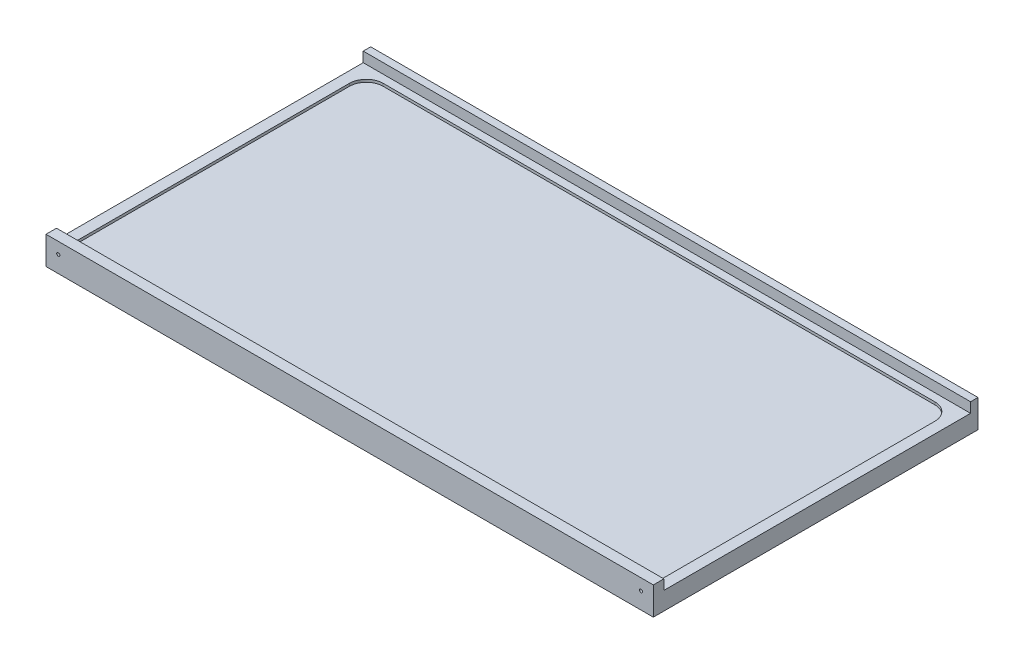
ISO-10303-21;
HEADER;
FILE_DESCRIPTION(('STEP AP214'),'2;1');
FILE_NAME('part.step','',(''),(''),'','','');
FILE_SCHEMA(('AUTOMOTIVE_DESIGN { 1 0 10303 214 1 1 1 1 }'));
ENDSEC;
DATA;
#1=APPLICATION_CONTEXT('core data for automotive mechanical design processes');
#2=APPLICATION_PROTOCOL_DEFINITION('international standard','automotive_design',2000,#1);
#3=PRODUCT_CONTEXT('',#1,'mechanical');
#4=PRODUCT('Part','Part','',(#3));
#5=PRODUCT_RELATED_PRODUCT_CATEGORY('part','',(#4));
#6=PRODUCT_DEFINITION_FORMATION('','',#4);
#7=PRODUCT_DEFINITION_CONTEXT('part definition',#1,'design');
#8=PRODUCT_DEFINITION('design','',#6,#7);
#9=PRODUCT_DEFINITION_SHAPE('','',#8);
#10=(LENGTH_UNIT() NAMED_UNIT(*) SI_UNIT(.MILLI.,.METRE.));
#11=(NAMED_UNIT(*) PLANE_ANGLE_UNIT() SI_UNIT($,.RADIAN.));
#12=(NAMED_UNIT(*) SI_UNIT($,.STERADIAN.) SOLID_ANGLE_UNIT());
#13=UNCERTAINTY_MEASURE_WITH_UNIT(LENGTH_MEASURE(1.E-05),#10,'distance_accuracy_value','');
#14=(GEOMETRIC_REPRESENTATION_CONTEXT(3) GLOBAL_UNCERTAINTY_ASSIGNED_CONTEXT((#13)) GLOBAL_UNIT_ASSIGNED_CONTEXT((#10,
#11,#12)) REPRESENTATION_CONTEXT('',''));
#15=CARTESIAN_POINT('',(0.,0.,0.));
#16=DIRECTION('',(0.,0.,1.));
#17=DIRECTION('',(1.,0.,0.));
#18=AXIS2_PLACEMENT_3D('',#15,#16,#17);
#19=CARTESIAN_POINT('',(-990.,8.49999999999976,479.25));
#20=DIRECTION('',(0.,-1.,0.));
#21=DIRECTION('',(0.,0.,-1.));
#22=AXIS2_PLACEMENT_3D('',#19,#20,#21);
#23=PLANE('',#22);
#24=DIRECTION('',(-1.,0.,0.));
#25=VECTOR('',#24,1.);
#26=CARTESIAN_POINT('',(-990.,8.49999999999976,495.));
#27=LINE('',#26,#25);
#28=CARTESIAN_POINT('',(990.,8.49999999999976,495.));
#29=VERTEX_POINT('',#28);
#30=CARTESIAN_POINT('',(952.819131071803,8.49999999999976,495.));
#31=VERTEX_POINT('',#30);
#32=EDGE_CURVE('E51',#29,#31,#27,.T.);
#33=ORIENTED_EDGE('',*,*,#32,.F.);
#34=DIRECTION('',(0.,0.,-1.));
#35=VECTOR('',#34,1.);
#36=CARTESIAN_POINT('',(990.,8.49999999999976,479.25));
#37=LINE('',#36,#35);
#38=CARTESIAN_POINT('',(990.,8.49999999999976,-505.));
#39=VERTEX_POINT('',#38);
#40=EDGE_CURVE('E210',#29,#39,#37,.T.);
#41=ORIENTED_EDGE('',*,*,#40,.T.);
#42=DIRECTION('',(1.,0.,0.));
#43=VECTOR('',#42,1.);
#44=CARTESIAN_POINT('',(-990.,8.49999999999976,-505.));
#45=LINE('',#44,#43);
#46=CARTESIAN_POINT('',(-990.,8.49999999999976,-505.));
#47=VERTEX_POINT('',#46);
#48=EDGE_CURVE('E272',#47,#39,#45,.T.);
#49=ORIENTED_EDGE('',*,*,#48,.F.);
#50=DIRECTION('',(0.,0.,-1.));
#51=VECTOR('',#50,1.);
#52=CARTESIAN_POINT('',(-990.,8.49999999999976,479.25));
#53=LINE('',#52,#51);
#54=CARTESIAN_POINT('',(-990.,8.49999999999976,495.));
#55=VERTEX_POINT('',#54);
#56=EDGE_CURVE('E358',#55,#47,#53,.T.);
#57=ORIENTED_EDGE('',*,*,#56,.F.);
#58=CARTESIAN_POINT('',(-952.819131071802,8.49999999999976,495.));
#59=VERTEX_POINT('',#58);
#60=EDGE_CURVE('E217',#59,#55,#27,.T.);
#61=ORIENTED_EDGE('',*,*,#60,.F.);
#62=DIRECTION('',(0.,0.,1.));
#63=VECTOR('',#62,1.);
#64=CARTESIAN_POINT('',(-952.819131071802,8.49999999999976,464.825021663794));
#65=LINE('',#64,#63);
#66=CARTESIAN_POINT('',(-952.819131071802,8.49999999999975,479.25));
#67=VERTEX_POINT('',#66);
#68=EDGE_CURVE('E303',#67,#59,#65,.T.);
#69=ORIENTED_EDGE('',*,*,#68,.F.);
#70=DIRECTION('',(1.,0.,0.));
#71=VECTOR('',#70,1.);
#72=CARTESIAN_POINT('',(-990.,8.49999999999973,479.25));
#73=LINE('',#72,#71);
#74=CARTESIAN_POINT('',(-954.25,8.49999999999973,479.25));
#75=VERTEX_POINT('',#74);
#76=EDGE_CURVE('E311',#75,#67,#73,.T.);
#77=ORIENTED_EDGE('',*,*,#76,.F.);
#78=DIRECTION('',(0.,0.,-1.));
#79=VECTOR('',#78,1.);
#80=CARTESIAN_POINT('',(-954.25,8.49999999999976,479.25));
#81=LINE('',#80,#79);
#82=CARTESIAN_POINT('',(-954.25,8.49999999999976,-424.25));
#83=VERTEX_POINT('',#82);
#84=EDGE_CURVE('E360',#75,#83,#81,.T.);
#85=ORIENTED_EDGE('',*,*,#84,.T.);
#86=CARTESIAN_POINT('',(-899.25,8.49999999999976,-424.25));
#87=DIRECTION('',(0.,-1.,0.));
#88=DIRECTION('',(0.,0.,-1.));
#89=AXIS2_PLACEMENT_3D('',#86,#87,#88);
#90=CIRCLE('',#89,55.);
#91=CARTESIAN_POINT('',(-899.25,8.49999999999973,-479.25));
#92=VERTEX_POINT('',#91);
#93=EDGE_CURVE('E246',#83,#92,#90,.T.);
#94=ORIENTED_EDGE('',*,*,#93,.T.);
#95=DIRECTION('',(-1.,0.,0.));
#96=VECTOR('',#95,1.);
#97=CARTESIAN_POINT('',(-990.,8.49999999999973,-479.25));
#98=LINE('',#97,#96);
#99=CARTESIAN_POINT('',(899.25,8.49999999999973,-479.25));
#100=VERTEX_POINT('',#99);
#101=EDGE_CURVE('E325',#100,#92,#98,.T.);
#102=ORIENTED_EDGE('',*,*,#101,.F.);
#103=CARTESIAN_POINT('',(899.25,8.49999999999976,-424.25));
#104=DIRECTION('',(0.,-1.,0.));
#105=DIRECTION('',(0.,0.,-1.));
#106=AXIS2_PLACEMENT_3D('',#103,#104,#105);
#107=CIRCLE('',#106,55.);
#108=CARTESIAN_POINT('',(954.25,8.49999999999976,-424.25));
#109=VERTEX_POINT('',#108);
#110=EDGE_CURVE('E244',#100,#109,#107,.T.);
#111=ORIENTED_EDGE('',*,*,#110,.T.);
#112=DIRECTION('',(0.,0.,-1.));
#113=VECTOR('',#112,1.);
#114=CARTESIAN_POINT('',(954.25,8.49999999999976,479.25));
#115=LINE('',#114,#113);
#116=CARTESIAN_POINT('',(954.25,8.49999999999976,479.25));
#117=VERTEX_POINT('',#116);
#118=EDGE_CURVE('E224',#117,#109,#115,.T.);
#119=ORIENTED_EDGE('',*,*,#118,.F.);
#120=CARTESIAN_POINT('',(952.819131071803,8.49999999999976,479.25));
#121=VERTEX_POINT('',#120);
#122=EDGE_CURVE('E316',#121,#117,#73,.T.);
#123=ORIENTED_EDGE('',*,*,#122,.F.);
#124=DIRECTION('',(0.,0.,1.));
#125=VECTOR('',#124,1.);
#126=CARTESIAN_POINT('',(952.819131071803,8.49999999999976,464.825021663794));
#127=LINE('',#126,#125);
#128=EDGE_CURVE('E213',#31,#121,#127,.F.);
#129=ORIENTED_EDGE('',*,*,#128,.F.);
#130=EDGE_LOOP('',(#33,#41,#49,#57,#61,#69,#77,#85,#94,#102,#111,#119,#123,#129));
#131=FACE_BOUND('',#130,.T.);
#132=ADVANCED_FACE('F36',(#131),#23,.F.);
#133=CARTESIAN_POINT('',(947.180868928197,8.49999999999976,495.));
#134=VERTEX_POINT('',#133);
#135=CARTESIAN_POINT('',(-947.180868928198,8.49999999999976,495.));
#136=VERTEX_POINT('',#135);
#137=EDGE_CURVE('E57',#134,#136,#27,.T.);
#138=ORIENTED_EDGE('',*,*,#137,.F.);
#139=DIRECTION('',(0.,0.,1.));
#140=VECTOR('',#139,1.);
#141=CARTESIAN_POINT('',(947.180868928197,8.49999999999976,464.825021663794));
#142=LINE('',#141,#140);
#143=CARTESIAN_POINT('',(947.180868928197,8.49999999999976,479.25));
#144=VERTEX_POINT('',#143);
#145=EDGE_CURVE('E299',#144,#134,#142,.T.);
#146=ORIENTED_EDGE('',*,*,#145,.F.);
#147=CARTESIAN_POINT('',(-947.180868928198,8.49999999999975,479.25));
#148=VERTEX_POINT('',#147);
#149=EDGE_CURVE('E315',#148,#144,#73,.T.);
#150=ORIENTED_EDGE('',*,*,#149,.F.);
#151=DIRECTION('',(0.,0.,1.));
#152=VECTOR('',#151,1.);
#153=CARTESIAN_POINT('',(-947.180868928198,8.49999999999976,464.825021663794));
#154=LINE('',#153,#152);
#155=EDGE_CURVE('E306',#136,#148,#154,.F.);
#156=ORIENTED_EDGE('',*,*,#155,.F.);
#157=EDGE_LOOP('',(#138,#146,#150,#156));
#158=FACE_BOUND('',#157,.T.);
#159=ADVANCED_FACE('F444',(#158),#23,.F.);
#160=CARTESIAN_POINT('',(-990.,1989.13121251787,479.25));
#161=DIRECTION('',(0.,0.,1.));
#162=DIRECTION('',(1.,0.,0.));
#163=AXIS2_PLACEMENT_3D('',#160,#161,#162);
#164=PLANE('',#163);
#165=CARTESIAN_POINT('',(-950.,4.25,479.25));
#166=DIRECTION('',(0.,0.,1.));
#167=DIRECTION('',(1.,0.,0.));
#168=AXIS2_PLACEMENT_3D('',#165,#166,#167);
#169=CIRCLE('',#168,5.09999999999998);
#170=CARTESIAN_POINT('',(-954.25,1.43086892819807,479.25));
#171=VERTEX_POINT('',#170);
#172=CARTESIAN_POINT('',(-952.819131071802,0.,479.25));
#173=VERTEX_POINT('',#172);
#174=EDGE_CURVE('E510',#171,#173,#169,.T.);
#175=ORIENTED_EDGE('',*,*,#174,.T.);
#176=DIRECTION('',(-1.,0.,0.));
#177=VECTOR('',#176,1.);
#178=CARTESIAN_POINT('',(-954.25,0.,479.25));
#179=LINE('',#178,#177);
#180=CARTESIAN_POINT('',(-954.25,0.,479.25));
#181=VERTEX_POINT('',#180);
#182=EDGE_CURVE('E340',#173,#181,#179,.T.);
#183=ORIENTED_EDGE('',*,*,#182,.T.);
#184=DIRECTION('',(0.,1.,0.));
#185=VECTOR('',#184,1.);
#186=CARTESIAN_POINT('',(-954.25,8.49999999999976,479.25));
#187=LINE('',#186,#185);
#188=EDGE_CURVE('E348',#181,#171,#187,.T.);
#189=ORIENTED_EDGE('',*,*,#188,.T.);
#190=EDGE_LOOP('',(#175,#183,#189));
#191=FACE_BOUND('',#190,.T.);
#192=ADVANCED_FACE('F450',(#191),#164,.F.);
#193=CARTESIAN_POINT('',(-954.25,7.06913107180193,479.25));
#194=VERTEX_POINT('',#193);
#195=EDGE_CURVE('E295',#67,#194,#169,.T.);
#196=ORIENTED_EDGE('',*,*,#195,.T.);
#197=EDGE_CURVE('E346',#194,#75,#187,.T.);
#198=ORIENTED_EDGE('',*,*,#197,.T.);
#199=ORIENTED_EDGE('',*,*,#76,.T.);
#200=EDGE_LOOP('',(#196,#198,#199));
#201=FACE_BOUND('',#200,.T.);
#202=ADVANCED_FACE('F505',(#201),#164,.F.);
#203=CARTESIAN_POINT('',(950.,4.25000000000023,479.25));
#204=DIRECTION('',(0.,0.,1.));
#205=DIRECTION('',(1.,0.,0.));
#206=AXIS2_PLACEMENT_3D('',#203,#204,#205);
#207=CIRCLE('',#206,5.09999999999998);
#208=CARTESIAN_POINT('',(952.819131071802,0.,479.25));
#209=VERTEX_POINT('',#208);
#210=CARTESIAN_POINT('',(954.25,1.4308689281983,479.25));
#211=VERTEX_POINT('',#210);
#212=EDGE_CURVE('E419',#209,#211,#207,.T.);
#213=ORIENTED_EDGE('',*,*,#212,.T.);
#214=DIRECTION('',(0.,-1.,0.));
#215=VECTOR('',#214,1.);
#216=CARTESIAN_POINT('',(954.25,8.49999999999976,479.25));
#217=LINE('',#216,#215);
#218=CARTESIAN_POINT('',(954.25,0.,479.25));
#219=VERTEX_POINT('',#218);
#220=EDGE_CURVE('E342',#211,#219,#217,.T.);
#221=ORIENTED_EDGE('',*,*,#220,.T.);
#222=EDGE_CURVE('E343',#219,#209,#179,.T.);
#223=ORIENTED_EDGE('',*,*,#222,.T.);
#224=EDGE_LOOP('',(#213,#221,#223));
#225=FACE_BOUND('',#224,.T.);
#226=ADVANCED_FACE('F430',(#225),#164,.F.);
#227=CARTESIAN_POINT('',(-947.180868928198,0.,479.25));
#228=VERTEX_POINT('',#227);
#229=EDGE_CURVE('E290',#228,#148,#169,.T.);
#230=ORIENTED_EDGE('',*,*,#229,.T.);
#231=ORIENTED_EDGE('',*,*,#149,.T.);
#232=CARTESIAN_POINT('',(947.180868928198,0.,479.25));
#233=VERTEX_POINT('',#232);
#234=EDGE_CURVE('E298',#144,#233,#207,.T.);
#235=ORIENTED_EDGE('',*,*,#234,.T.);
#236=EDGE_CURVE('E405',#233,#228,#179,.T.);
#237=ORIENTED_EDGE('',*,*,#236,.T.);
#238=EDGE_LOOP('',(#230,#231,#235,#237));
#239=FACE_BOUND('',#238,.T.);
#240=ADVANCED_FACE('F421',(#239),#164,.F.);
#241=CARTESIAN_POINT('',(990.,8.49999999999976,479.25));
#242=DIRECTION('',(-1.,0.,0.));
#243=DIRECTION('',(0.,0.,1.));
#244=AXIS2_PLACEMENT_3D('',#241,#242,#243);
#245=PLANE('',#244);
#246=DIRECTION('',(0.,0.,-1.));
#247=VECTOR('',#246,1.);
#248=CARTESIAN_POINT('',(990.,-50.,479.25));
#249=LINE('',#248,#247);
#250=CARTESIAN_POINT('',(990.,-50.,529.25));
#251=VERTEX_POINT('',#250);
#252=CARTESIAN_POINT('',(990.,-50.,-529.25));
#253=VERTEX_POINT('',#252);
#254=EDGE_CURVE('E351',#251,#253,#249,.T.);
#255=ORIENTED_EDGE('',*,*,#254,.T.);
#256=DIRECTION('',(0.,-1.,0.));
#257=VECTOR('',#256,1.);
#258=CARTESIAN_POINT('',(990.,1989.13121251787,-529.25));
#259=LINE('',#258,#257);
#260=CARTESIAN_POINT('',(990.,41.2000000000023,-529.25));
#261=VERTEX_POINT('',#260);
#262=EDGE_CURVE('E332',#261,#253,#259,.T.);
#263=ORIENTED_EDGE('',*,*,#262,.F.);
#264=DIRECTION('',(0.,0.,1.));
#265=VECTOR('',#264,1.);
#266=CARTESIAN_POINT('',(990.,41.2000000000023,479.25));
#267=LINE('',#266,#265);
#268=CARTESIAN_POINT('',(990.,41.2000000000023,-505.));
#269=VERTEX_POINT('',#268);
#270=EDGE_CURVE('E276',#261,#269,#267,.T.);
#271=ORIENTED_EDGE('',*,*,#270,.T.);
#272=DIRECTION('',(0.,-1.,0.));
#273=VECTOR('',#272,1.);
#274=CARTESIAN_POINT('',(990.,2021.49620574802,-505.));
#275=LINE('',#274,#273);
#276=EDGE_CURVE('E221',#269,#39,#275,.T.);
#277=ORIENTED_EDGE('',*,*,#276,.T.);
#278=ORIENTED_EDGE('',*,*,#40,.F.);
#279=DIRECTION('',(0.,-1.,0.));
#280=VECTOR('',#279,1.);
#281=CARTESIAN_POINT('',(990.,2021.49620574802,495.));
#282=LINE('',#281,#280);
#283=CARTESIAN_POINT('',(990.,41.2000000000023,495.));
#284=VERTEX_POINT('',#283);
#285=EDGE_CURVE('E197',#284,#29,#282,.T.);
#286=ORIENTED_EDGE('',*,*,#285,.F.);
#287=DIRECTION('',(0.,0.,1.));
#288=VECTOR('',#287,1.);
#289=CARTESIAN_POINT('',(990.,41.2000000000023,479.250000000006));
#290=LINE('',#289,#288);
#291=CARTESIAN_POINT('',(990.,41.2000000000023,529.25));
#292=VERTEX_POINT('',#291);
#293=EDGE_CURVE('E543',#284,#292,#290,.T.);
#294=ORIENTED_EDGE('',*,*,#293,.T.);
#295=DIRECTION('',(0.,-1.,0.));
#296=VECTOR('',#295,1.);
#297=CARTESIAN_POINT('',(990.,1989.13121251787,529.25));
#298=LINE('',#297,#296);
#299=EDGE_CURVE('E322',#292,#251,#298,.T.);
#300=ORIENTED_EDGE('',*,*,#299,.T.);
#301=EDGE_LOOP('',(#255,#263,#271,#277,#278,#286,#294,#300));
#302=FACE_BOUND('',#301,.T.);
#303=ADVANCED_FACE('F218',(#302),#245,.F.);
#304=CARTESIAN_POINT('',(954.25,8.49999999999976,479.25));
#305=DIRECTION('',(1.,0.,0.));
#306=DIRECTION('',(0.,0.,-1.));
#307=AXIS2_PLACEMENT_3D('',#304,#305,#306);
#308=PLANE('',#307);
#309=ORIENTED_EDGE('',*,*,#118,.T.);
#310=DIRECTION('',(0.,-1.,0.));
#311=VECTOR('',#310,1.);
#312=CARTESIAN_POINT('',(954.25,0.,-424.25));
#313=LINE('',#312,#311);
#314=CARTESIAN_POINT('',(954.25,0.,-424.25));
#315=VERTEX_POINT('',#314);
#316=EDGE_CURVE('E223',#109,#315,#313,.T.);
#317=ORIENTED_EDGE('',*,*,#316,.T.);
#318=DIRECTION('',(0.,0.,-1.));
#319=VECTOR('',#318,1.);
#320=CARTESIAN_POINT('',(954.25,0.,479.25));
#321=LINE('',#320,#319);
#322=EDGE_CURVE('E230',#219,#315,#321,.T.);
#323=ORIENTED_EDGE('',*,*,#322,.F.);
#324=ORIENTED_EDGE('',*,*,#220,.F.);
#325=CARTESIAN_POINT('',(954.25,7.06913107180216,479.25));
#326=VERTEX_POINT('',#325);
#327=EDGE_CURVE('E341',#326,#211,#217,.T.);
#328=ORIENTED_EDGE('',*,*,#327,.F.);
#329=EDGE_CURVE('E337',#117,#326,#217,.T.);
#330=ORIENTED_EDGE('',*,*,#329,.F.);
#331=EDGE_LOOP('',(#309,#317,#323,#324,#328,#330));
#332=FACE_BOUND('',#331,.T.);
#333=ADVANCED_FACE('F374',(#332),#308,.F.);
#334=CARTESIAN_POINT('',(-954.25,0.,479.25));
#335=DIRECTION('',(0.,-1.,0.));
#336=DIRECTION('',(0.,0.,-1.));
#337=AXIS2_PLACEMENT_3D('',#334,#335,#336);
#338=PLANE('',#337);
#339=ORIENTED_EDGE('',*,*,#322,.T.);
#340=CARTESIAN_POINT('',(899.25,0.,-424.25));
#341=DIRECTION('',(0.,-1.,0.));
#342=DIRECTION('',(0.,0.,-1.));
#343=AXIS2_PLACEMENT_3D('',#340,#341,#342);
#344=CIRCLE('',#343,55.);
#345=CARTESIAN_POINT('',(899.25,0.,-479.25));
#346=VERTEX_POINT('',#345);
#347=EDGE_CURVE('E235',#315,#346,#344,.F.);
#348=ORIENTED_EDGE('',*,*,#347,.T.);
#349=DIRECTION('',(-1.,0.,0.));
#350=VECTOR('',#349,1.);
#351=CARTESIAN_POINT('',(-954.25,0.,-479.25));
#352=LINE('',#351,#350);
#353=CARTESIAN_POINT('',(-899.25,0.,-479.25));
#354=VERTEX_POINT('',#353);
#355=EDGE_CURVE('E328',#346,#354,#352,.T.);
#356=ORIENTED_EDGE('',*,*,#355,.T.);
#357=CARTESIAN_POINT('',(-899.25,0.,-424.25));
#358=DIRECTION('',(0.,-1.,0.));
#359=DIRECTION('',(0.,0.,-1.));
#360=AXIS2_PLACEMENT_3D('',#357,#358,#359);
#361=CIRCLE('',#360,55.);
#362=CARTESIAN_POINT('',(-954.25,0.,-424.25));
#363=VERTEX_POINT('',#362);
#364=EDGE_CURVE('E227',#354,#363,#361,.F.);
#365=ORIENTED_EDGE('',*,*,#364,.T.);
#366=DIRECTION('',(0.,0.,-1.));
#367=VECTOR('',#366,1.);
#368=CARTESIAN_POINT('',(-954.25,0.,479.25));
#369=LINE('',#368,#367);
#370=EDGE_CURVE('E363',#181,#363,#369,.T.);
#371=ORIENTED_EDGE('',*,*,#370,.F.);
#372=ORIENTED_EDGE('',*,*,#182,.F.);
#373=EDGE_CURVE('E401',#228,#173,#179,.T.);
#374=ORIENTED_EDGE('',*,*,#373,.F.);
#375=ORIENTED_EDGE('',*,*,#236,.F.);
#376=EDGE_CURVE('E347',#209,#233,#179,.T.);
#377=ORIENTED_EDGE('',*,*,#376,.F.);
#378=ORIENTED_EDGE('',*,*,#222,.F.);
#379=EDGE_LOOP('',(#339,#348,#356,#365,#371,#372,#374,#375,#377,#378));
#380=FACE_BOUND('',#379,.T.);
#381=ADVANCED_FACE('F369',(#380),#338,.F.);
#382=CARTESIAN_POINT('',(-954.25,8.49999999999976,479.25));
#383=DIRECTION('',(-1.,0.,0.));
#384=DIRECTION('',(0.,0.,1.));
#385=AXIS2_PLACEMENT_3D('',#382,#383,#384);
#386=PLANE('',#385);
#387=ORIENTED_EDGE('',*,*,#370,.T.);
#388=DIRECTION('',(0.,1.,0.));
#389=VECTOR('',#388,1.);
#390=CARTESIAN_POINT('',(-954.25,8.49999999999973,-424.25));
#391=LINE('',#390,#389);
#392=EDGE_CURVE('E241',#363,#83,#391,.T.);
#393=ORIENTED_EDGE('',*,*,#392,.T.);
#394=ORIENTED_EDGE('',*,*,#84,.F.);
#395=ORIENTED_EDGE('',*,*,#197,.F.);
#396=EDGE_CURVE('E352',#171,#194,#187,.T.);
#397=ORIENTED_EDGE('',*,*,#396,.F.);
#398=ORIENTED_EDGE('',*,*,#188,.F.);
#399=EDGE_LOOP('',(#387,#393,#394,#395,#397,#398));
#400=FACE_BOUND('',#399,.T.);
#401=ADVANCED_FACE('F393',(#400),#386,.F.);
#402=CARTESIAN_POINT('',(-990.,-50.,479.25));
#403=DIRECTION('',(1.,0.,0.));
#404=DIRECTION('',(0.,0.,-1.));
#405=AXIS2_PLACEMENT_3D('',#402,#403,#404);
#406=PLANE('',#405);
#407=DIRECTION('',(0.,-1.,0.));
#408=VECTOR('',#407,1.);
#409=CARTESIAN_POINT('',(-990.,1989.13121251787,529.25));
#410=LINE('',#409,#408);
#411=CARTESIAN_POINT('',(-990.,41.2000000000023,529.25));
#412=VERTEX_POINT('',#411);
#413=CARTESIAN_POINT('',(-990.,-50.,529.25));
#414=VERTEX_POINT('',#413);
#415=EDGE_CURVE('E319',#412,#414,#410,.T.);
#416=ORIENTED_EDGE('',*,*,#415,.F.);
#417=DIRECTION('',(0.,0.,-1.));
#418=VECTOR('',#417,1.);
#419=CARTESIAN_POINT('',(-990.,41.2000000000023,479.25));
#420=LINE('',#419,#418);
#421=CARTESIAN_POINT('',(-990.,41.2000000000023,495.));
#422=VERTEX_POINT('',#421);
#423=EDGE_CURVE('E204',#412,#422,#420,.T.);
#424=ORIENTED_EDGE('',*,*,#423,.T.);
#425=DIRECTION('',(0.,-1.,0.));
#426=VECTOR('',#425,1.);
#427=CARTESIAN_POINT('',(-990.,2021.49620574802,495.));
#428=LINE('',#427,#426);
#429=EDGE_CURVE('E205',#422,#55,#428,.T.);
#430=ORIENTED_EDGE('',*,*,#429,.T.);
#431=ORIENTED_EDGE('',*,*,#56,.T.);
#432=DIRECTION('',(0.,-1.,0.));
#433=VECTOR('',#432,1.);
#434=CARTESIAN_POINT('',(-990.,2021.49620574802,-505.));
#435=LINE('',#434,#433);
#436=CARTESIAN_POINT('',(-990.,41.2000000000023,-505.));
#437=VERTEX_POINT('',#436);
#438=EDGE_CURVE('E284',#437,#47,#435,.T.);
#439=ORIENTED_EDGE('',*,*,#438,.F.);
#440=DIRECTION('',(0.,0.,-1.));
#441=VECTOR('',#440,1.);
#442=CARTESIAN_POINT('',(-990.,41.2000000000023,479.25));
#443=LINE('',#442,#441);
#444=CARTESIAN_POINT('',(-990.,41.2000000000023,-529.25));
#445=VERTEX_POINT('',#444);
#446=EDGE_CURVE('E277',#437,#445,#443,.T.);
#447=ORIENTED_EDGE('',*,*,#446,.T.);
#448=DIRECTION('',(0.,-1.,0.));
#449=VECTOR('',#448,1.);
#450=CARTESIAN_POINT('',(-990.,1989.13121251787,-529.25));
#451=LINE('',#450,#449);
#452=CARTESIAN_POINT('',(-990.,-50.,-529.25));
#453=VERTEX_POINT('',#452);
#454=EDGE_CURVE('E329',#445,#453,#451,.T.);
#455=ORIENTED_EDGE('',*,*,#454,.T.);
#456=DIRECTION('',(0.,0.,-1.));
#457=VECTOR('',#456,1.);
#458=CARTESIAN_POINT('',(-990.,-50.,479.25));
#459=LINE('',#458,#457);
#460=EDGE_CURVE('E356',#414,#453,#459,.T.);
#461=ORIENTED_EDGE('',*,*,#460,.F.);
#462=EDGE_LOOP('',(#416,#424,#430,#431,#439,#447,#455,#461));
#463=FACE_BOUND('',#462,.T.);
#464=ADVANCED_FACE('F453',(#463),#406,.F.);
#465=CARTESIAN_POINT('',(-990.,-50.,479.25));
#466=DIRECTION('',(0.,1.,0.));
#467=DIRECTION('',(0.,0.,1.));
#468=AXIS2_PLACEMENT_3D('',#465,#466,#467);
#469=PLANE('',#468);
#470=ORIENTED_EDGE('',*,*,#460,.T.);
#471=DIRECTION('',(-1.,0.,0.));
#472=VECTOR('',#471,1.);
#473=CARTESIAN_POINT('',(-990.,-50.,-529.25));
#474=LINE('',#473,#472);
#475=EDGE_CURVE('E314',#253,#453,#474,.T.);
#476=ORIENTED_EDGE('',*,*,#475,.F.);
#477=ORIENTED_EDGE('',*,*,#254,.F.);
#478=DIRECTION('',(1.,0.,0.));
#479=VECTOR('',#478,1.);
#480=CARTESIAN_POINT('',(-990.,-50.,529.25));
#481=LINE('',#480,#479);
#482=EDGE_CURVE('E310',#414,#251,#481,.T.);
#483=ORIENTED_EDGE('',*,*,#482,.F.);
#484=EDGE_LOOP('',(#470,#476,#477,#483));
#485=FACE_BOUND('',#484,.T.);
#486=ADVANCED_FACE('F474',(#485),#469,.F.);
#487=CARTESIAN_POINT('',(-990.,1989.13121251787,-479.25));
#488=DIRECTION('',(0.,0.,-1.));
#489=DIRECTION('',(-1.,0.,0.));
#490=AXIS2_PLACEMENT_3D('',#487,#488,#489);
#491=PLANE('',#490);
#492=ORIENTED_EDGE('',*,*,#355,.F.);
#493=DIRECTION('',(0.,-1.,0.));
#494=VECTOR('',#493,1.);
#495=CARTESIAN_POINT('',(899.25,8.49999999999973,-479.25));
#496=LINE('',#495,#494);
#497=EDGE_CURVE('E239',#346,#100,#496,.F.);
#498=ORIENTED_EDGE('',*,*,#497,.T.);
#499=ORIENTED_EDGE('',*,*,#101,.T.);
#500=DIRECTION('',(0.,1.,0.));
#501=VECTOR('',#500,1.);
#502=CARTESIAN_POINT('',(-899.25,0.,-479.25));
#503=LINE('',#502,#501);
#504=EDGE_CURVE('E237',#92,#354,#503,.F.);
#505=ORIENTED_EDGE('',*,*,#504,.T.);
#506=EDGE_LOOP('',(#492,#498,#499,#505));
#507=FACE_BOUND('',#506,.T.);
#508=ADVANCED_FACE('F385',(#507),#491,.F.);
#509=CARTESIAN_POINT('',(-990.,1989.13121251787,-529.25));
#510=DIRECTION('',(0.,0.,1.));
#511=DIRECTION('',(1.,0.,0.));
#512=AXIS2_PLACEMENT_3D('',#509,#510,#511);
#513=PLANE('',#512);
#514=ORIENTED_EDGE('',*,*,#454,.F.);
#515=DIRECTION('',(1.,0.,0.));
#516=VECTOR('',#515,1.);
#517=CARTESIAN_POINT('',(-990.,41.2000000000023,-529.25));
#518=LINE('',#517,#516);
#519=EDGE_CURVE('E273',#445,#261,#518,.T.);
#520=ORIENTED_EDGE('',*,*,#519,.T.);
#521=ORIENTED_EDGE('',*,*,#262,.T.);
#522=ORIENTED_EDGE('',*,*,#475,.T.);
#523=EDGE_LOOP('',(#514,#520,#521,#522));
#524=FACE_BOUND('',#523,.T.);
#525=ADVANCED_FACE('F463',(#524),#513,.F.);
#526=CARTESIAN_POINT('',(899.25,8.49999999999976,-424.25));
#527=DIRECTION('',(0.,1.,0.));
#528=DIRECTION('',(0.,0.,1.));
#529=AXIS2_PLACEMENT_3D('',#526,#527,#528);
#530=CYLINDRICAL_SURFACE('',#529,55.);
#531=ORIENTED_EDGE('',*,*,#110,.F.);
#532=ORIENTED_EDGE('',*,*,#497,.F.);
#533=ORIENTED_EDGE('',*,*,#347,.F.);
#534=ORIENTED_EDGE('',*,*,#316,.F.);
#535=EDGE_LOOP('',(#531,#532,#533,#534));
#536=FACE_BOUND('',#535,.T.);
#537=ADVANCED_FACE('F381',(#536),#530,.F.);
#538=CARTESIAN_POINT('',(-899.25,8.49999999999976,-424.25));
#539=DIRECTION('',(0.,-1.,0.));
#540=DIRECTION('',(0.,0.,-1.));
#541=AXIS2_PLACEMENT_3D('',#538,#539,#540);
#542=CYLINDRICAL_SURFACE('',#541,55.);
#543=ORIENTED_EDGE('',*,*,#364,.F.);
#544=ORIENTED_EDGE('',*,*,#504,.F.);
#545=ORIENTED_EDGE('',*,*,#93,.F.);
#546=ORIENTED_EDGE('',*,*,#392,.F.);
#547=EDGE_LOOP('',(#543,#544,#545,#546));
#548=FACE_BOUND('',#547,.T.);
#549=ADVANCED_FACE('F38',(#548),#542,.F.);
#550=EDGE_CURVE('E294',#326,#121,#207,.T.);
#551=ORIENTED_EDGE('',*,*,#550,.T.);
#552=ORIENTED_EDGE('',*,*,#122,.T.);
#553=ORIENTED_EDGE('',*,*,#329,.T.);
#554=EDGE_LOOP('',(#551,#552,#553));
#555=FACE_BOUND('',#554,.T.);
#556=ADVANCED_FACE('F426',(#555),#164,.F.);
#557=CARTESIAN_POINT('',(-990.,1989.13121251787,529.25));
#558=DIRECTION('',(0.,0.,-1.));
#559=DIRECTION('',(-1.,0.,0.));
#560=AXIS2_PLACEMENT_3D('',#557,#558,#559);
#561=PLANE('',#560);
#562=DIRECTION('',(-1.,0.,0.));
#563=VECTOR('',#562,1.);
#564=CARTESIAN_POINT('',(-990.,41.2000000000023,529.25));
#565=LINE('',#564,#563);
#566=EDGE_CURVE('E264',#292,#412,#565,.T.);
#567=ORIENTED_EDGE('',*,*,#566,.T.);
#568=ORIENTED_EDGE('',*,*,#415,.T.);
#569=ORIENTED_EDGE('',*,*,#482,.T.);
#570=ORIENTED_EDGE('',*,*,#299,.F.);
#571=EDGE_LOOP('',(#567,#568,#569,#570));
#572=FACE_BOUND('',#571,.T.);
#573=DIRECTION('',(1.,0.,0.));
#574=VECTOR('',#573,1.);
#575=CARTESIAN_POINT('',(-990.,8.49999999999976,529.25));
#576=LINE('',#575,#574);
#577=CARTESIAN_POINT('',(-952.819131071802,8.49999999999973,529.25));
#578=VERTEX_POINT('',#577);
#579=CARTESIAN_POINT('',(-947.180868928198,8.49999999999976,529.25));
#580=VERTEX_POINT('',#579);
#581=EDGE_CURVE('E260',#578,#580,#576,.T.);
#582=ORIENTED_EDGE('',*,*,#581,.T.);
#583=CARTESIAN_POINT('',(-950.,4.25,529.25));
#584=DIRECTION('',(0.,0.,-1.));
#585=DIRECTION('',(-1.,0.,0.));
#586=AXIS2_PLACEMENT_3D('',#583,#584,#585);
#587=CIRCLE('',#586,5.09999999999998);
#588=EDGE_CURVE('E11',#578,#580,#587,.F.);
#589=ORIENTED_EDGE('',*,*,#588,.F.);
#590=EDGE_LOOP('',(#582,#589));
#591=FACE_BOUND('',#590,.T.);
#592=CARTESIAN_POINT('',(950.,4.25000000000023,529.25));
#593=DIRECTION('',(0.,0.,-1.));
#594=DIRECTION('',(-1.,0.,0.));
#595=AXIS2_PLACEMENT_3D('',#592,#593,#594);
#596=CIRCLE('',#595,5.09999999999998);
#597=CARTESIAN_POINT('',(947.180868928197,8.49999999999976,529.25));
#598=VERTEX_POINT('',#597);
#599=CARTESIAN_POINT('',(952.819131071803,8.49999999999976,529.25));
#600=VERTEX_POINT('',#599);
#601=EDGE_CURVE('E44',#598,#600,#596,.F.);
#602=ORIENTED_EDGE('',*,*,#601,.F.);
#603=EDGE_CURVE('E258',#598,#600,#576,.T.);
#604=ORIENTED_EDGE('',*,*,#603,.T.);
#605=EDGE_LOOP('',(#602,#604));
#606=FACE_BOUND('',#605,.T.);
#607=ADVANCED_FACE('F257',(#572,#591,#606),#561,.F.);
#608=CARTESIAN_POINT('',(-990.,1989.13121251787,479.25));
#609=DIRECTION('',(0.,0.,1.));
#610=DIRECTION('',(1.,0.,0.));
#611=AXIS2_PLACEMENT_3D('',#608,#609,#610);
#612=PLANE('',#611);
#613=ORIENTED_EDGE('',*,*,#327,.T.);
#614=EDGE_CURVE('E282',#211,#326,#207,.T.);
#615=ORIENTED_EDGE('',*,*,#614,.T.);
#616=EDGE_LOOP('',(#613,#615));
#617=FACE_BOUND('',#616,.T.);
#618=ADVANCED_FACE('F431',(#617),#612,.T.);
#619=ORIENTED_EDGE('',*,*,#376,.T.);
#620=EDGE_CURVE('E415',#233,#209,#207,.T.);
#621=ORIENTED_EDGE('',*,*,#620,.T.);
#622=EDGE_LOOP('',(#619,#621));
#623=FACE_BOUND('',#622,.T.);
#624=ADVANCED_FACE('F414',(#623),#612,.T.);
#625=CARTESIAN_POINT('',(950.,4.25000000000023,464.825021663794));
#626=DIRECTION('',(0.,0.,1.));
#627=DIRECTION('',(1.,0.,0.));
#628=AXIS2_PLACEMENT_3D('',#625,#626,#627);
#629=CYLINDRICAL_SURFACE('',#628,5.09999999999998);
#630=EDGE_CURVE('E252',#600,#31,#127,.F.);
#631=ORIENTED_EDGE('',*,*,#630,.T.);
#632=ORIENTED_EDGE('',*,*,#128,.T.);
#633=ORIENTED_EDGE('',*,*,#550,.F.);
#634=ORIENTED_EDGE('',*,*,#614,.F.);
#635=ORIENTED_EDGE('',*,*,#212,.F.);
#636=ORIENTED_EDGE('',*,*,#620,.F.);
#637=ORIENTED_EDGE('',*,*,#234,.F.);
#638=ORIENTED_EDGE('',*,*,#145,.T.);
#639=DIRECTION('',(0.,0.,1.));
#640=VECTOR('',#639,1.);
#641=CARTESIAN_POINT('',(947.180868928197,8.49999999999976,464.825021663794));
#642=LINE('',#641,#640);
#643=EDGE_CURVE('E254',#134,#598,#642,.T.);
#644=ORIENTED_EDGE('',*,*,#643,.T.);
#645=ORIENTED_EDGE('',*,*,#601,.T.);
#646=EDGE_LOOP('',(#631,#632,#633,#634,#635,#636,#637,#638,#644,#645));
#647=FACE_BOUND('',#646,.T.);
#648=ADVANCED_FACE('F251',(#647),#629,.F.);
#649=CARTESIAN_POINT('',(-990.,1989.13121251787,479.25));
#650=DIRECTION('',(0.,0.,1.));
#651=DIRECTION('',(1.,0.,0.));
#652=AXIS2_PLACEMENT_3D('',#649,#650,#651);
#653=PLANE('',#652);
#654=ORIENTED_EDGE('',*,*,#373,.T.);
#655=EDGE_CURVE('E293',#173,#228,#169,.T.);
#656=ORIENTED_EDGE('',*,*,#655,.T.);
#657=EDGE_LOOP('',(#654,#656));
#658=FACE_BOUND('',#657,.T.);
#659=ADVANCED_FACE('F511',(#658),#653,.T.);
#660=ORIENTED_EDGE('',*,*,#396,.T.);
#661=EDGE_CURVE('E509',#194,#171,#169,.T.);
#662=ORIENTED_EDGE('',*,*,#661,.T.);
#663=EDGE_LOOP('',(#660,#662));
#664=FACE_BOUND('',#663,.T.);
#665=ADVANCED_FACE('F508',(#664),#653,.T.);
#666=CARTESIAN_POINT('',(-950.,4.25,464.825021663794));
#667=DIRECTION('',(0.,0.,1.));
#668=DIRECTION('',(1.,0.,0.));
#669=AXIS2_PLACEMENT_3D('',#666,#667,#668);
#670=CYLINDRICAL_SURFACE('',#669,5.09999999999998);
#671=EDGE_CURVE('E307',#580,#136,#154,.F.);
#672=ORIENTED_EDGE('',*,*,#671,.T.);
#673=ORIENTED_EDGE('',*,*,#155,.T.);
#674=ORIENTED_EDGE('',*,*,#229,.F.);
#675=ORIENTED_EDGE('',*,*,#655,.F.);
#676=ORIENTED_EDGE('',*,*,#174,.F.);
#677=ORIENTED_EDGE('',*,*,#661,.F.);
#678=ORIENTED_EDGE('',*,*,#195,.F.);
#679=ORIENTED_EDGE('',*,*,#68,.T.);
#680=EDGE_CURVE('E302',#59,#578,#65,.T.);
#681=ORIENTED_EDGE('',*,*,#680,.T.);
#682=ORIENTED_EDGE('',*,*,#588,.T.);
#683=EDGE_LOOP('',(#672,#673,#674,#675,#676,#677,#678,#679,#681,#682));
#684=FACE_BOUND('',#683,.T.);
#685=ADVANCED_FACE('F496',(#684),#670,.F.);
#686=CARTESIAN_POINT('',(-990.,2021.49620574802,-505.));
#687=DIRECTION('',(0.,0.,-1.));
#688=DIRECTION('',(-1.,0.,0.));
#689=AXIS2_PLACEMENT_3D('',#686,#687,#688);
#690=PLANE('',#689);
#691=ORIENTED_EDGE('',*,*,#276,.F.);
#692=DIRECTION('',(-1.,0.,0.));
#693=VECTOR('',#692,1.);
#694=CARTESIAN_POINT('',(-990.,41.2000000000023,-505.));
#695=LINE('',#694,#693);
#696=EDGE_CURVE('E279',#269,#437,#695,.T.);
#697=ORIENTED_EDGE('',*,*,#696,.T.);
#698=ORIENTED_EDGE('',*,*,#438,.T.);
#699=ORIENTED_EDGE('',*,*,#48,.T.);
#700=EDGE_LOOP('',(#691,#697,#698,#699));
#701=FACE_BOUND('',#700,.T.);
#702=ADVANCED_FACE('F489',(#701),#690,.F.);
#703=CARTESIAN_POINT('',(-1050.,41.2000000000024,529.25));
#704=DIRECTION('',(0.,-1.,0.));
#705=DIRECTION('',(0.,0.,-1.));
#706=AXIS2_PLACEMENT_3D('',#703,#704,#705);
#707=PLANE('',#706);
#708=ORIENTED_EDGE('',*,*,#270,.F.);
#709=ORIENTED_EDGE('',*,*,#519,.F.);
#710=ORIENTED_EDGE('',*,*,#446,.F.);
#711=ORIENTED_EDGE('',*,*,#696,.F.);
#712=EDGE_LOOP('',(#708,#709,#710,#711));
#713=FACE_BOUND('',#712,.T.);
#714=ADVANCED_FACE('F487',(#713),#707,.F.);
#715=CARTESIAN_POINT('',(0.,8.49999999999976,0.));
#716=DIRECTION('',(0.,1.,0.));
#717=DIRECTION('',(0.,0.,1.));
#718=AXIS2_PLACEMENT_3D('',#715,#716,#717);
#719=PLANE('',#718);
#720=ORIENTED_EDGE('',*,*,#643,.F.);
#721=EDGE_CURVE('E215',#31,#134,#27,.T.);
#722=ORIENTED_EDGE('',*,*,#721,.F.);
#723=ORIENTED_EDGE('',*,*,#630,.F.);
#724=ORIENTED_EDGE('',*,*,#603,.F.);
#725=EDGE_LOOP('',(#720,#722,#723,#724));
#726=FACE_BOUND('',#725,.T.);
#727=ADVANCED_FACE('F528',(#726),#719,.F.);
#728=ORIENTED_EDGE('',*,*,#680,.F.);
#729=EDGE_CURVE('E494',#136,#59,#27,.T.);
#730=ORIENTED_EDGE('',*,*,#729,.F.);
#731=ORIENTED_EDGE('',*,*,#671,.F.);
#732=ORIENTED_EDGE('',*,*,#581,.F.);
#733=EDGE_LOOP('',(#728,#730,#731,#732));
#734=FACE_BOUND('',#733,.T.);
#735=ADVANCED_FACE('F500',(#734),#719,.F.);
#736=CARTESIAN_POINT('',(-990.,2021.49620574802,495.));
#737=DIRECTION('',(0.,0.,1.));
#738=DIRECTION('',(1.,0.,0.));
#739=AXIS2_PLACEMENT_3D('',#736,#737,#738);
#740=PLANE('',#739);
#741=ORIENTED_EDGE('',*,*,#429,.F.);
#742=DIRECTION('',(1.,0.,0.));
#743=VECTOR('',#742,1.);
#744=CARTESIAN_POINT('',(-990.,41.2000000000023,495.));
#745=LINE('',#744,#743);
#746=EDGE_CURVE('E200',#422,#284,#745,.T.);
#747=ORIENTED_EDGE('',*,*,#746,.T.);
#748=ORIENTED_EDGE('',*,*,#285,.T.);
#749=ORIENTED_EDGE('',*,*,#32,.T.);
#750=ORIENTED_EDGE('',*,*,#721,.T.);
#751=ORIENTED_EDGE('',*,*,#137,.T.);
#752=ORIENTED_EDGE('',*,*,#729,.T.);
#753=ORIENTED_EDGE('',*,*,#60,.T.);
#754=EDGE_LOOP('',(#741,#747,#748,#749,#750,#751,#752,#753));
#755=FACE_BOUND('',#754,.T.);
#756=ADVANCED_FACE('F199',(#755),#740,.F.);
#757=CARTESIAN_POINT('',(-1050.,41.2000000000024,529.25));
#758=DIRECTION('',(0.,-1.,0.));
#759=DIRECTION('',(0.,0.,-1.));
#760=AXIS2_PLACEMENT_3D('',#757,#758,#759);
#761=PLANE('',#760);
#762=ORIENTED_EDGE('',*,*,#293,.F.);
#763=ORIENTED_EDGE('',*,*,#746,.F.);
#764=ORIENTED_EDGE('',*,*,#423,.F.);
#765=ORIENTED_EDGE('',*,*,#566,.F.);
#766=EDGE_LOOP('',(#762,#763,#764,#765));
#767=FACE_BOUND('',#766,.T.);
#768=ADVANCED_FACE('F535',(#767),#761,.F.);
#769=CLOSED_SHELL('',(#132,#159,#192,#202,#226,#240,#303,#333,#381,#401,#464,#486,#508,#525,
#537,#549,#556,#607,#618,#624,#648,#659,#665,#685,#702,#714,#727,#735,#756,#768));
#770=MANIFOLD_SOLID_BREP('B2',#769);
#771=ADVANCED_BREP_SHAPE_REPRESENTATION('',(#18,#770),#14);
#772=SHAPE_DEFINITION_REPRESENTATION(#9,#771);
ENDSEC;
END-ISO-10303-21;
